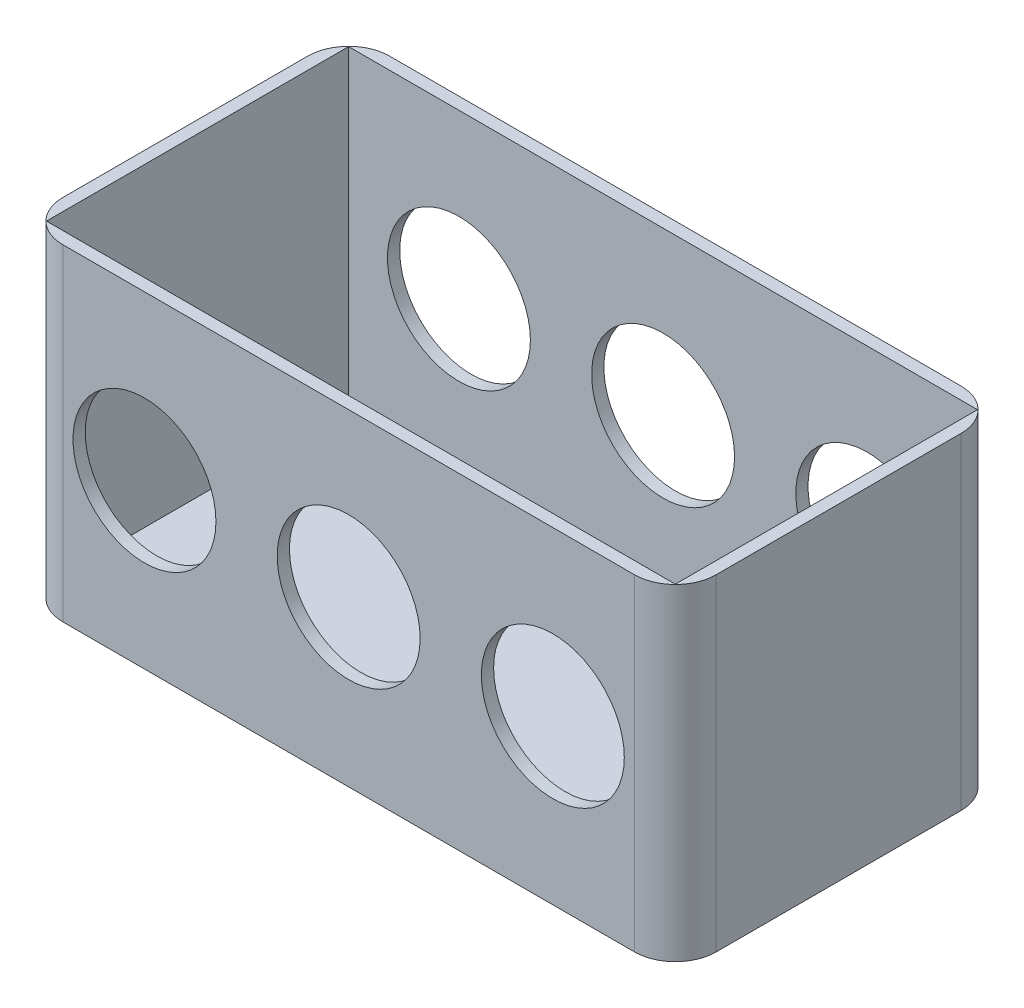
ISO-10303-21;
HEADER;
FILE_DESCRIPTION(('STEP AP214'),'2;1');
FILE_NAME('part.step','',(''),(''),'','','');
FILE_SCHEMA(('AUTOMOTIVE_DESIGN { 1 0 10303 214 1 1 1 1 }'));
ENDSEC;
DATA;
#1=APPLICATION_CONTEXT('core data for automotive mechanical design processes');
#2=APPLICATION_PROTOCOL_DEFINITION('international standard','automotive_design',2000,#1);
#3=PRODUCT_CONTEXT('',#1,'mechanical');
#4=PRODUCT('Part','Part','',(#3));
#5=PRODUCT_RELATED_PRODUCT_CATEGORY('part','',(#4));
#6=PRODUCT_DEFINITION_FORMATION('','',#4);
#7=PRODUCT_DEFINITION_CONTEXT('part definition',#1,'design');
#8=PRODUCT_DEFINITION('design','',#6,#7);
#9=PRODUCT_DEFINITION_SHAPE('','',#8);
#10=(LENGTH_UNIT() NAMED_UNIT(*) SI_UNIT(.MILLI.,.METRE.));
#11=(NAMED_UNIT(*) PLANE_ANGLE_UNIT() SI_UNIT($,.RADIAN.));
#12=(NAMED_UNIT(*) SI_UNIT($,.STERADIAN.) SOLID_ANGLE_UNIT());
#13=UNCERTAINTY_MEASURE_WITH_UNIT(LENGTH_MEASURE(1.E-05),#10,'distance_accuracy_value','');
#14=(GEOMETRIC_REPRESENTATION_CONTEXT(3) GLOBAL_UNCERTAINTY_ASSIGNED_CONTEXT((#13)) GLOBAL_UNIT_ASSIGNED_CONTEXT((#10,
#11,#12)) REPRESENTATION_CONTEXT('',''));
#15=CARTESIAN_POINT('',(0.,0.,0.));
#16=DIRECTION('',(0.,0.,1.));
#17=DIRECTION('',(1.,0.,0.));
#18=AXIS2_PLACEMENT_3D('',#15,#16,#17);
#19=CARTESIAN_POINT('',(80.,80.,-40.));
#20=DIRECTION('',(-1.,0.,0.));
#21=DIRECTION('',(0.,0.,1.));
#22=AXIS2_PLACEMENT_3D('',#19,#20,#21);
#23=PLANE('',#22);
#24=DIRECTION('',(0.,0.,-1.));
#25=VECTOR('',#24,1.);
#26=CARTESIAN_POINT('',(80.,80.,-40.));
#27=LINE('',#26,#25);
#28=CARTESIAN_POINT('',(80.,80.,30.));
#29=VERTEX_POINT('',#28);
#30=CARTESIAN_POINT('',(80.,80.,-30.));
#31=VERTEX_POINT('',#30);
#32=EDGE_CURVE('E176',#29,#31,#27,.T.);
#33=ORIENTED_EDGE('',*,*,#32,.F.);
#34=DIRECTION('',(0.,-1.,0.));
#35=VECTOR('',#34,1.);
#36=CARTESIAN_POINT('',(80.,80.,30.));
#37=LINE('',#36,#35);
#38=CARTESIAN_POINT('',(80.,0.,30.));
#39=VERTEX_POINT('',#38);
#40=EDGE_CURVE('E261',#29,#39,#37,.T.);
#41=ORIENTED_EDGE('',*,*,#40,.T.);
#42=DIRECTION('',(0.,0.,-1.));
#43=VECTOR('',#42,1.);
#44=CARTESIAN_POINT('',(80.,0.,-40.));
#45=LINE('',#44,#43);
#46=CARTESIAN_POINT('',(80.,0.,-30.));
#47=VERTEX_POINT('',#46);
#48=EDGE_CURVE('E192',#39,#47,#45,.T.);
#49=ORIENTED_EDGE('',*,*,#48,.T.);
#50=DIRECTION('',(0.,-1.,0.));
#51=VECTOR('',#50,1.);
#52=CARTESIAN_POINT('',(80.,80.,-30.));
#53=LINE('',#52,#51);
#54=EDGE_CURVE('E258',#47,#31,#53,.F.);
#55=ORIENTED_EDGE('',*,*,#54,.T.);
#56=EDGE_LOOP('',(#33,#41,#49,#55));
#57=FACE_BOUND('',#56,.T.);
#58=ADVANCED_FACE('F39',(#57),#23,.F.);
#59=CARTESIAN_POINT('',(-80.,80.,-40.));
#60=DIRECTION('',(0.,0.,1.));
#61=DIRECTION('',(1.,0.,0.));
#62=AXIS2_PLACEMENT_3D('',#59,#60,#61);
#63=PLANE('',#62);
#64=CARTESIAN_POINT('',(-50.,40.,-40.));
#65=DIRECTION('',(0.,0.,1.));
#66=DIRECTION('',(1.,0.,0.));
#67=AXIS2_PLACEMENT_3D('',#64,#65,#66);
#68=CIRCLE('',#67,17.5);
#69=CARTESIAN_POINT('',(-32.5,40.,-40.));
#70=VERTEX_POINT('',#69);
#71=EDGE_CURVE('E211',#70,#70,#68,.T.);
#72=ORIENTED_EDGE('',*,*,#71,.T.);
#73=EDGE_LOOP('',(#72));
#74=FACE_BOUND('',#73,.T.);
#75=CARTESIAN_POINT('',(0.,40.2550575623075,-40.));
#76=DIRECTION('',(0.,0.,1.));
#77=DIRECTION('',(1.,0.,0.));
#78=AXIS2_PLACEMENT_3D('',#75,#76,#77);
#79=CIRCLE('',#78,17.5);
#80=CARTESIAN_POINT('',(17.5,40.2550575623075,-40.));
#81=VERTEX_POINT('',#80);
#82=EDGE_CURVE('E296',#81,#81,#79,.T.);
#83=ORIENTED_EDGE('',*,*,#82,.T.);
#84=EDGE_LOOP('',(#83));
#85=FACE_BOUND('',#84,.T.);
#86=CARTESIAN_POINT('',(50.,40.,-40.));
#87=DIRECTION('',(0.,0.,1.));
#88=DIRECTION('',(1.,0.,0.));
#89=AXIS2_PLACEMENT_3D('',#86,#87,#88);
#90=CIRCLE('',#89,17.5);
#91=CARTESIAN_POINT('',(67.5,40.,-40.));
#92=VERTEX_POINT('',#91);
#93=EDGE_CURVE('E288',#92,#92,#90,.T.);
#94=ORIENTED_EDGE('',*,*,#93,.T.);
#95=EDGE_LOOP('',(#94));
#96=FACE_BOUND('',#95,.T.);
#97=DIRECTION('',(-1.,0.,0.));
#98=VECTOR('',#97,1.);
#99=CARTESIAN_POINT('',(-80.,80.,-40.));
#100=LINE('',#99,#98);
#101=CARTESIAN_POINT('',(70.,80.,-40.));
#102=VERTEX_POINT('',#101);
#103=CARTESIAN_POINT('',(-70.,80.,-40.));
#104=VERTEX_POINT('',#103);
#105=EDGE_CURVE('E179',#102,#104,#100,.T.);
#106=ORIENTED_EDGE('',*,*,#105,.F.);
#107=DIRECTION('',(0.,-1.,0.));
#108=VECTOR('',#107,1.);
#109=CARTESIAN_POINT('',(70.,80.,-40.));
#110=LINE('',#109,#108);
#111=CARTESIAN_POINT('',(70.,0.,-40.));
#112=VERTEX_POINT('',#111);
#113=EDGE_CURVE('E11',#102,#112,#110,.T.);
#114=ORIENTED_EDGE('',*,*,#113,.T.);
#115=DIRECTION('',(-1.,0.,0.));
#116=VECTOR('',#115,1.);
#117=CARTESIAN_POINT('',(-80.,0.,-40.));
#118=LINE('',#117,#116);
#119=CARTESIAN_POINT('',(-70.,0.,-40.));
#120=VERTEX_POINT('',#119);
#121=EDGE_CURVE('E196',#112,#120,#118,.T.);
#122=ORIENTED_EDGE('',*,*,#121,.T.);
#123=DIRECTION('',(0.,-1.,0.));
#124=VECTOR('',#123,1.);
#125=CARTESIAN_POINT('',(-70.,80.,-40.));
#126=LINE('',#125,#124);
#127=EDGE_CURVE('E48',#120,#104,#126,.F.);
#128=ORIENTED_EDGE('',*,*,#127,.T.);
#129=EDGE_LOOP('',(#106,#114,#122,#128));
#130=FACE_BOUND('',#129,.T.);
#131=ADVANCED_FACE('F308',(#74,#85,#96,#130),#63,.F.);
#132=CARTESIAN_POINT('',(-80.,80.,-40.));
#133=DIRECTION('',(1.,0.,0.));
#134=DIRECTION('',(0.,0.,-1.));
#135=AXIS2_PLACEMENT_3D('',#132,#133,#134);
#136=PLANE('',#135);
#137=DIRECTION('',(0.,0.,1.));
#138=VECTOR('',#137,1.);
#139=CARTESIAN_POINT('',(-80.,0.,-40.));
#140=LINE('',#139,#138);
#141=CARTESIAN_POINT('',(-80.,0.,-30.));
#142=VERTEX_POINT('',#141);
#143=CARTESIAN_POINT('',(-80.,0.,30.));
#144=VERTEX_POINT('',#143);
#145=EDGE_CURVE('E199',#142,#144,#140,.T.);
#146=ORIENTED_EDGE('',*,*,#145,.T.);
#147=DIRECTION('',(0.,-1.,0.));
#148=VECTOR('',#147,1.);
#149=CARTESIAN_POINT('',(-80.,80.,30.));
#150=LINE('',#149,#148);
#151=CARTESIAN_POINT('',(-80.,80.,30.));
#152=VERTEX_POINT('',#151);
#153=EDGE_CURVE('E244',#144,#152,#150,.F.);
#154=ORIENTED_EDGE('',*,*,#153,.T.);
#155=DIRECTION('',(0.,0.,1.));
#156=VECTOR('',#155,1.);
#157=CARTESIAN_POINT('',(-80.,80.,-40.));
#158=LINE('',#157,#156);
#159=CARTESIAN_POINT('',(-80.,80.,-30.));
#160=VERTEX_POINT('',#159);
#161=EDGE_CURVE('E183',#160,#152,#158,.T.);
#162=ORIENTED_EDGE('',*,*,#161,.F.);
#163=DIRECTION('',(0.,-1.,0.));
#164=VECTOR('',#163,1.);
#165=CARTESIAN_POINT('',(-80.,80.,-30.));
#166=LINE('',#165,#164);
#167=EDGE_CURVE('E240',#160,#142,#166,.T.);
#168=ORIENTED_EDGE('',*,*,#167,.T.);
#169=EDGE_LOOP('',(#146,#154,#162,#168));
#170=FACE_BOUND('',#169,.T.);
#171=ADVANCED_FACE('F337',(#170),#136,.F.);
#172=CARTESIAN_POINT('',(-80.,80.,40.));
#173=DIRECTION('',(0.,0.,-1.));
#174=DIRECTION('',(-1.,0.,0.));
#175=AXIS2_PLACEMENT_3D('',#172,#173,#174);
#176=PLANE('',#175);
#177=CARTESIAN_POINT('',(-50.,40.,40.));
#178=DIRECTION('',(0.,0.,1.));
#179=DIRECTION('',(1.,0.,0.));
#180=AXIS2_PLACEMENT_3D('',#177,#178,#179);
#181=CIRCLE('',#180,17.5);
#182=CARTESIAN_POINT('',(-32.5,40.,40.));
#183=VERTEX_POINT('',#182);
#184=EDGE_CURVE('E300',#183,#183,#181,.T.);
#185=ORIENTED_EDGE('',*,*,#184,.F.);
#186=EDGE_LOOP('',(#185));
#187=FACE_BOUND('',#186,.T.);
#188=CARTESIAN_POINT('',(0.,40.2550575623075,40.));
#189=DIRECTION('',(0.,0.,1.));
#190=DIRECTION('',(1.,0.,0.));
#191=AXIS2_PLACEMENT_3D('',#188,#189,#190);
#192=CIRCLE('',#191,17.5);
#193=CARTESIAN_POINT('',(17.5,40.2550575623075,40.));
#194=VERTEX_POINT('',#193);
#195=EDGE_CURVE('E292',#194,#194,#192,.T.);
#196=ORIENTED_EDGE('',*,*,#195,.F.);
#197=EDGE_LOOP('',(#196));
#198=FACE_BOUND('',#197,.T.);
#199=CARTESIAN_POINT('',(50.,40.,40.));
#200=DIRECTION('',(0.,0.,1.));
#201=DIRECTION('',(1.,0.,0.));
#202=AXIS2_PLACEMENT_3D('',#199,#200,#201);
#203=CIRCLE('',#202,17.5);
#204=CARTESIAN_POINT('',(67.5,40.,40.));
#205=VERTEX_POINT('',#204);
#206=EDGE_CURVE('E284',#205,#205,#203,.T.);
#207=ORIENTED_EDGE('',*,*,#206,.F.);
#208=EDGE_LOOP('',(#207));
#209=FACE_BOUND('',#208,.T.);
#210=DIRECTION('',(1.,0.,0.));
#211=VECTOR('',#210,1.);
#212=CARTESIAN_POINT('',(-80.,80.,40.));
#213=LINE('',#212,#211);
#214=CARTESIAN_POINT('',(-70.,80.,40.));
#215=VERTEX_POINT('',#214);
#216=CARTESIAN_POINT('',(70.,80.,40.));
#217=VERTEX_POINT('',#216);
#218=EDGE_CURVE('E187',#215,#217,#213,.T.);
#219=ORIENTED_EDGE('',*,*,#218,.F.);
#220=DIRECTION('',(0.,-1.,0.));
#221=VECTOR('',#220,1.);
#222=CARTESIAN_POINT('',(-70.,80.,40.));
#223=LINE('',#222,#221);
#224=CARTESIAN_POINT('',(-70.,0.,40.));
#225=VERTEX_POINT('',#224);
#226=EDGE_CURVE('E224',#215,#225,#223,.T.);
#227=ORIENTED_EDGE('',*,*,#226,.T.);
#228=DIRECTION('',(1.,0.,0.));
#229=VECTOR('',#228,1.);
#230=CARTESIAN_POINT('',(-80.,0.,40.));
#231=LINE('',#230,#229);
#232=CARTESIAN_POINT('',(70.,0.,40.));
#233=VERTEX_POINT('',#232);
#234=EDGE_CURVE('E180',#225,#233,#231,.T.);
#235=ORIENTED_EDGE('',*,*,#234,.T.);
#236=DIRECTION('',(0.,-1.,0.));
#237=VECTOR('',#236,1.);
#238=CARTESIAN_POINT('',(70.,80.,40.));
#239=LINE('',#238,#237);
#240=EDGE_CURVE('E191',#233,#217,#239,.F.);
#241=ORIENTED_EDGE('',*,*,#240,.T.);
#242=EDGE_LOOP('',(#219,#227,#235,#241));
#243=FACE_BOUND('',#242,.T.);
#244=ADVANCED_FACE('F369',(#187,#198,#209,#243),#176,.F.);
#245=CARTESIAN_POINT('',(0.,80.,0.));
#246=DIRECTION('',(0.,1.,0.));
#247=DIRECTION('',(0.,0.,1.));
#248=AXIS2_PLACEMENT_3D('',#245,#246,#247);
#249=PLANE('',#248);
#250=DIRECTION('',(0.,0.,-1.));
#251=VECTOR('',#250,1.);
#252=CARTESIAN_POINT('',(77.,80.,-40.));
#253=LINE('',#252,#251);
#254=CARTESIAN_POINT('',(77.,80.,37.));
#255=VERTEX_POINT('',#254);
#256=CARTESIAN_POINT('',(77.,80.,-37.));
#257=VERTEX_POINT('',#256);
#258=EDGE_CURVE('E160',#255,#257,#253,.T.);
#259=ORIENTED_EDGE('',*,*,#258,.F.);
#260=DIRECTION('',(1.,0.,0.));
#261=VECTOR('',#260,1.);
#262=CARTESIAN_POINT('',(-80.,80.,37.));
#263=LINE('',#262,#261);
#264=CARTESIAN_POINT('',(-77.,80.,37.));
#265=VERTEX_POINT('',#264);
#266=EDGE_CURVE('E173',#265,#255,#263,.T.);
#267=ORIENTED_EDGE('',*,*,#266,.F.);
#268=DIRECTION('',(0.,0.,1.));
#269=VECTOR('',#268,1.);
#270=CARTESIAN_POINT('',(-77.,80.,-40.));
#271=LINE('',#270,#269);
#272=CARTESIAN_POINT('',(-77.,80.,-37.));
#273=VERTEX_POINT('',#272);
#274=EDGE_CURVE('E170',#273,#265,#271,.T.);
#275=ORIENTED_EDGE('',*,*,#274,.F.);
#276=DIRECTION('',(-1.,0.,0.));
#277=VECTOR('',#276,1.);
#278=CARTESIAN_POINT('',(-80.,80.,-37.));
#279=LINE('',#278,#277);
#280=EDGE_CURVE('E146',#257,#273,#279,.T.);
#281=ORIENTED_EDGE('',*,*,#280,.F.);
#282=EDGE_LOOP('',(#259,#267,#275,#281));
#283=FACE_BOUND('',#282,.T.);
#284=ORIENTED_EDGE('',*,*,#161,.T.);
#285=CARTESIAN_POINT('',(-70.,80.,30.));
#286=DIRECTION('',(0.,1.,0.));
#287=DIRECTION('',(0.,0.,1.));
#288=AXIS2_PLACEMENT_3D('',#285,#286,#287);
#289=CIRCLE('',#288,10.);
#290=EDGE_CURVE('E255',#152,#215,#289,.T.);
#291=ORIENTED_EDGE('',*,*,#290,.T.);
#292=ORIENTED_EDGE('',*,*,#218,.T.);
#293=CARTESIAN_POINT('',(70.,80.,30.));
#294=DIRECTION('',(0.,1.,0.));
#295=DIRECTION('',(0.,0.,1.));
#296=AXIS2_PLACEMENT_3D('',#293,#294,#295);
#297=CIRCLE('',#296,10.);
#298=EDGE_CURVE('E252',#217,#29,#297,.T.);
#299=ORIENTED_EDGE('',*,*,#298,.T.);
#300=ORIENTED_EDGE('',*,*,#32,.T.);
#301=CARTESIAN_POINT('',(70.,80.,-30.));
#302=DIRECTION('',(0.,1.,0.));
#303=DIRECTION('',(0.,0.,1.));
#304=AXIS2_PLACEMENT_3D('',#301,#302,#303);
#305=CIRCLE('',#304,10.);
#306=EDGE_CURVE('E61',#31,#102,#305,.T.);
#307=ORIENTED_EDGE('',*,*,#306,.T.);
#308=ORIENTED_EDGE('',*,*,#105,.T.);
#309=CARTESIAN_POINT('',(-70.,80.,-30.));
#310=DIRECTION('',(0.,1.,0.));
#311=DIRECTION('',(0.,0.,1.));
#312=AXIS2_PLACEMENT_3D('',#309,#310,#311);
#313=CIRCLE('',#312,10.);
#314=EDGE_CURVE('E247',#104,#160,#313,.T.);
#315=ORIENTED_EDGE('',*,*,#314,.T.);
#316=EDGE_LOOP('',(#284,#291,#292,#299,#300,#307,#308,#315));
#317=FACE_BOUND('',#316,.T.);
#318=ADVANCED_FACE('F365',(#283,#317),#249,.T.);
#319=CARTESIAN_POINT('',(0.,0.,0.));
#320=DIRECTION('',(0.,1.,0.));
#321=DIRECTION('',(0.,0.,1.));
#322=AXIS2_PLACEMENT_3D('',#319,#320,#321);
#323=PLANE('',#322);
#324=ORIENTED_EDGE('',*,*,#234,.F.);
#325=CARTESIAN_POINT('',(-70.,0.,30.));
#326=DIRECTION('',(0.,1.,0.));
#327=DIRECTION('',(0.,0.,1.));
#328=AXIS2_PLACEMENT_3D('',#325,#326,#327);
#329=CIRCLE('',#328,10.);
#330=EDGE_CURVE('E237',#225,#144,#329,.F.);
#331=ORIENTED_EDGE('',*,*,#330,.T.);
#332=ORIENTED_EDGE('',*,*,#145,.F.);
#333=CARTESIAN_POINT('',(-70.,0.,-30.));
#334=DIRECTION('',(0.,1.,0.));
#335=DIRECTION('',(0.,0.,1.));
#336=AXIS2_PLACEMENT_3D('',#333,#334,#335);
#337=CIRCLE('',#336,10.);
#338=EDGE_CURVE('E228',#142,#120,#337,.F.);
#339=ORIENTED_EDGE('',*,*,#338,.T.);
#340=ORIENTED_EDGE('',*,*,#121,.F.);
#341=CARTESIAN_POINT('',(70.,0.,-30.));
#342=DIRECTION('',(0.,1.,0.));
#343=DIRECTION('',(0.,0.,1.));
#344=AXIS2_PLACEMENT_3D('',#341,#342,#343);
#345=CIRCLE('',#344,10.);
#346=EDGE_CURVE('E231',#112,#47,#345,.F.);
#347=ORIENTED_EDGE('',*,*,#346,.T.);
#348=ORIENTED_EDGE('',*,*,#48,.F.);
#349=CARTESIAN_POINT('',(70.,0.,30.));
#350=DIRECTION('',(0.,1.,0.));
#351=DIRECTION('',(0.,0.,1.));
#352=AXIS2_PLACEMENT_3D('',#349,#350,#351);
#353=CIRCLE('',#352,10.);
#354=EDGE_CURVE('E234',#39,#233,#353,.F.);
#355=ORIENTED_EDGE('',*,*,#354,.T.);
#356=EDGE_LOOP('',(#324,#331,#332,#339,#340,#347,#348,#355));
#357=FACE_BOUND('',#356,.T.);
#358=ADVANCED_FACE('F356',(#357),#323,.F.);
#359=CARTESIAN_POINT('',(77.,80.,-40.));
#360=DIRECTION('',(-1.,0.,0.));
#361=DIRECTION('',(0.,0.,1.));
#362=AXIS2_PLACEMENT_3D('',#359,#360,#361);
#363=PLANE('',#362);
#364=DIRECTION('',(0.,0.,-1.));
#365=VECTOR('',#364,1.);
#366=CARTESIAN_POINT('',(77.,3.,-40.));
#367=LINE('',#366,#365);
#368=CARTESIAN_POINT('',(77.,3.,37.));
#369=VERTEX_POINT('',#368);
#370=CARTESIAN_POINT('',(77.,3.,-37.));
#371=VERTEX_POINT('',#370);
#372=EDGE_CURVE('E136',#369,#371,#367,.T.);
#373=ORIENTED_EDGE('',*,*,#372,.F.);
#374=DIRECTION('',(0.,-1.,0.));
#375=VECTOR('',#374,1.);
#376=CARTESIAN_POINT('',(77.,80.,37.));
#377=LINE('',#376,#375);
#378=EDGE_CURVE('E164',#255,#369,#377,.T.);
#379=ORIENTED_EDGE('',*,*,#378,.F.);
#380=ORIENTED_EDGE('',*,*,#258,.T.);
#381=DIRECTION('',(0.,-1.,0.));
#382=VECTOR('',#381,1.);
#383=CARTESIAN_POINT('',(77.,80.,-37.));
#384=LINE('',#383,#382);
#385=EDGE_CURVE('E151',#257,#371,#384,.T.);
#386=ORIENTED_EDGE('',*,*,#385,.T.);
#387=EDGE_LOOP('',(#373,#379,#380,#386));
#388=FACE_BOUND('',#387,.T.);
#389=ADVANCED_FACE('F386',(#388),#363,.T.);
#390=CARTESIAN_POINT('',(-80.,80.,-37.));
#391=DIRECTION('',(0.,0.,1.));
#392=DIRECTION('',(1.,0.,0.));
#393=AXIS2_PLACEMENT_3D('',#390,#391,#392);
#394=PLANE('',#393);
#395=CARTESIAN_POINT('',(-50.,40.,-37.));
#396=DIRECTION('',(0.,0.,1.));
#397=DIRECTION('',(1.,0.,0.));
#398=AXIS2_PLACEMENT_3D('',#395,#396,#397);
#399=CIRCLE('',#398,17.5);
#400=CARTESIAN_POINT('',(-32.5,40.,-37.));
#401=VERTEX_POINT('',#400);
#402=EDGE_CURVE('E221',#401,#401,#399,.T.);
#403=ORIENTED_EDGE('',*,*,#402,.F.);
#404=EDGE_LOOP('',(#403));
#405=FACE_BOUND('',#404,.T.);
#406=CARTESIAN_POINT('',(0.,40.2550575623075,-37.));
#407=DIRECTION('',(0.,0.,1.));
#408=DIRECTION('',(1.,0.,0.));
#409=AXIS2_PLACEMENT_3D('',#406,#407,#408);
#410=CIRCLE('',#409,17.5);
#411=CARTESIAN_POINT('',(17.5,40.2550575623075,-37.));
#412=VERTEX_POINT('',#411);
#413=EDGE_CURVE('E216',#412,#412,#410,.T.);
#414=ORIENTED_EDGE('',*,*,#413,.F.);
#415=EDGE_LOOP('',(#414));
#416=FACE_BOUND('',#415,.T.);
#417=CARTESIAN_POINT('',(50.,40.,-37.));
#418=DIRECTION('',(0.,0.,1.));
#419=DIRECTION('',(1.,0.,0.));
#420=AXIS2_PLACEMENT_3D('',#417,#418,#419);
#421=CIRCLE('',#420,17.5);
#422=CARTESIAN_POINT('',(67.5,40.,-37.));
#423=VERTEX_POINT('',#422);
#424=EDGE_CURVE('E210',#423,#423,#421,.T.);
#425=ORIENTED_EDGE('',*,*,#424,.F.);
#426=EDGE_LOOP('',(#425));
#427=FACE_BOUND('',#426,.T.);
#428=DIRECTION('',(-1.,0.,0.));
#429=VECTOR('',#428,1.);
#430=CARTESIAN_POINT('',(-80.,3.,-37.));
#431=LINE('',#430,#429);
#432=CARTESIAN_POINT('',(-77.,3.,-37.));
#433=VERTEX_POINT('',#432);
#434=EDGE_CURVE('E129',#371,#433,#431,.T.);
#435=ORIENTED_EDGE('',*,*,#434,.F.);
#436=ORIENTED_EDGE('',*,*,#385,.F.);
#437=ORIENTED_EDGE('',*,*,#280,.T.);
#438=DIRECTION('',(0.,-1.,0.));
#439=VECTOR('',#438,1.);
#440=CARTESIAN_POINT('',(-77.,80.,-37.));
#441=LINE('',#440,#439);
#442=EDGE_CURVE('E143',#273,#433,#441,.T.);
#443=ORIENTED_EDGE('',*,*,#442,.T.);
#444=EDGE_LOOP('',(#435,#436,#437,#443));
#445=FACE_BOUND('',#444,.T.);
#446=ADVANCED_FACE('F144',(#405,#416,#427,#445),#394,.T.);
#447=CARTESIAN_POINT('',(-77.,80.,-40.));
#448=DIRECTION('',(1.,0.,0.));
#449=DIRECTION('',(0.,0.,-1.));
#450=AXIS2_PLACEMENT_3D('',#447,#448,#449);
#451=PLANE('',#450);
#452=DIRECTION('',(0.,0.,1.));
#453=VECTOR('',#452,1.);
#454=CARTESIAN_POINT('',(-77.,3.,-40.));
#455=LINE('',#454,#453);
#456=CARTESIAN_POINT('',(-77.,3.,37.));
#457=VERTEX_POINT('',#456);
#458=EDGE_CURVE('E133',#433,#457,#455,.T.);
#459=ORIENTED_EDGE('',*,*,#458,.F.);
#460=ORIENTED_EDGE('',*,*,#442,.F.);
#461=ORIENTED_EDGE('',*,*,#274,.T.);
#462=DIRECTION('',(0.,-1.,0.));
#463=VECTOR('',#462,1.);
#464=CARTESIAN_POINT('',(-77.,80.,37.));
#465=LINE('',#464,#463);
#466=EDGE_CURVE('E152',#265,#457,#465,.T.);
#467=ORIENTED_EDGE('',*,*,#466,.T.);
#468=EDGE_LOOP('',(#459,#460,#461,#467));
#469=FACE_BOUND('',#468,.T.);
#470=ADVANCED_FACE('F154',(#469),#451,.T.);
#471=CARTESIAN_POINT('',(-80.,80.,37.));
#472=DIRECTION('',(0.,0.,-1.));
#473=DIRECTION('',(-1.,0.,0.));
#474=AXIS2_PLACEMENT_3D('',#471,#472,#473);
#475=PLANE('',#474);
#476=CARTESIAN_POINT('',(-50.,40.,37.));
#477=DIRECTION('',(0.,0.,-1.));
#478=DIRECTION('',(-1.,0.,0.));
#479=AXIS2_PLACEMENT_3D('',#476,#477,#478);
#480=CIRCLE('',#479,17.5);
#481=CARTESIAN_POINT('',(-67.5,40.,37.));
#482=VERTEX_POINT('',#481);
#483=EDGE_CURVE('E217',#482,#482,#480,.T.);
#484=ORIENTED_EDGE('',*,*,#483,.F.);
#485=EDGE_LOOP('',(#484));
#486=FACE_BOUND('',#485,.T.);
#487=CARTESIAN_POINT('',(0.,40.2550575623075,37.));
#488=DIRECTION('',(0.,0.,-1.));
#489=DIRECTION('',(-1.,0.,0.));
#490=AXIS2_PLACEMENT_3D('',#487,#488,#489);
#491=CIRCLE('',#490,17.5);
#492=CARTESIAN_POINT('',(-17.5,40.2550575623075,37.));
#493=VERTEX_POINT('',#492);
#494=EDGE_CURVE('E212',#493,#493,#491,.T.);
#495=ORIENTED_EDGE('',*,*,#494,.F.);
#496=EDGE_LOOP('',(#495));
#497=FACE_BOUND('',#496,.T.);
#498=CARTESIAN_POINT('',(50.,40.,37.));
#499=DIRECTION('',(0.,0.,-1.));
#500=DIRECTION('',(-1.,0.,0.));
#501=AXIS2_PLACEMENT_3D('',#498,#499,#500);
#502=CIRCLE('',#501,17.5);
#503=CARTESIAN_POINT('',(32.5,40.,37.));
#504=VERTEX_POINT('',#503);
#505=EDGE_CURVE('E206',#504,#504,#502,.T.);
#506=ORIENTED_EDGE('',*,*,#505,.F.);
#507=EDGE_LOOP('',(#506));
#508=FACE_BOUND('',#507,.T.);
#509=DIRECTION('',(1.,0.,0.));
#510=VECTOR('',#509,1.);
#511=CARTESIAN_POINT('',(-80.,3.,37.));
#512=LINE('',#511,#510);
#513=EDGE_CURVE('E157',#457,#369,#512,.T.);
#514=ORIENTED_EDGE('',*,*,#513,.F.);
#515=ORIENTED_EDGE('',*,*,#466,.F.);
#516=ORIENTED_EDGE('',*,*,#266,.T.);
#517=ORIENTED_EDGE('',*,*,#378,.T.);
#518=EDGE_LOOP('',(#514,#515,#516,#517));
#519=FACE_BOUND('',#518,.T.);
#520=ADVANCED_FACE('F391',(#486,#497,#508,#519),#475,.T.);
#521=CARTESIAN_POINT('',(0.,3.,0.));
#522=DIRECTION('',(0.,1.,0.));
#523=DIRECTION('',(0.,0.,1.));
#524=AXIS2_PLACEMENT_3D('',#521,#522,#523);
#525=PLANE('',#524);
#526=ORIENTED_EDGE('',*,*,#372,.T.);
#527=ORIENTED_EDGE('',*,*,#434,.T.);
#528=ORIENTED_EDGE('',*,*,#458,.T.);
#529=ORIENTED_EDGE('',*,*,#513,.T.);
#530=EDGE_LOOP('',(#526,#527,#528,#529));
#531=FACE_BOUND('',#530,.T.);
#532=ADVANCED_FACE('F131',(#531),#525,.T.);
#533=CARTESIAN_POINT('',(50.,40.,-40.));
#534=DIRECTION('',(0.,0.,1.));
#535=DIRECTION('',(1.,0.,0.));
#536=AXIS2_PLACEMENT_3D('',#533,#534,#535);
#537=CYLINDRICAL_SURFACE('',#536,17.5);
#538=ORIENTED_EDGE('',*,*,#505,.T.);
#539=EDGE_LOOP('',(#538));
#540=FACE_BOUND('',#539,.T.);
#541=ORIENTED_EDGE('',*,*,#206,.T.);
#542=EDGE_LOOP('',(#541));
#543=FACE_BOUND('',#542,.T.);
#544=ADVANCED_FACE('F390',(#540,#543),#537,.F.);
#545=CARTESIAN_POINT('',(0.,40.2550575623075,-40.));
#546=DIRECTION('',(0.,0.,1.));
#547=DIRECTION('',(1.,0.,0.));
#548=AXIS2_PLACEMENT_3D('',#545,#546,#547);
#549=CYLINDRICAL_SURFACE('',#548,17.5);
#550=ORIENTED_EDGE('',*,*,#494,.T.);
#551=EDGE_LOOP('',(#550));
#552=FACE_BOUND('',#551,.T.);
#553=ORIENTED_EDGE('',*,*,#195,.T.);
#554=EDGE_LOOP('',(#553));
#555=FACE_BOUND('',#554,.T.);
#556=ADVANCED_FACE('F328',(#552,#555),#549,.F.);
#557=CARTESIAN_POINT('',(-50.,40.,-40.));
#558=DIRECTION('',(0.,0.,1.));
#559=DIRECTION('',(1.,0.,0.));
#560=AXIS2_PLACEMENT_3D('',#557,#558,#559);
#561=CYLINDRICAL_SURFACE('',#560,17.5);
#562=ORIENTED_EDGE('',*,*,#483,.T.);
#563=EDGE_LOOP('',(#562));
#564=FACE_BOUND('',#563,.T.);
#565=ORIENTED_EDGE('',*,*,#184,.T.);
#566=EDGE_LOOP('',(#565));
#567=FACE_BOUND('',#566,.T.);
#568=ADVANCED_FACE('F317',(#564,#567),#561,.F.);
#569=ORIENTED_EDGE('',*,*,#424,.T.);
#570=EDGE_LOOP('',(#569));
#571=FACE_BOUND('',#570,.T.);
#572=ORIENTED_EDGE('',*,*,#93,.F.);
#573=EDGE_LOOP('',(#572));
#574=FACE_BOUND('',#573,.T.);
#575=ADVANCED_FACE('F325',(#571,#574),#537,.F.);
#576=ORIENTED_EDGE('',*,*,#413,.T.);
#577=EDGE_LOOP('',(#576));
#578=FACE_BOUND('',#577,.T.);
#579=ORIENTED_EDGE('',*,*,#82,.F.);
#580=EDGE_LOOP('',(#579));
#581=FACE_BOUND('',#580,.T.);
#582=ADVANCED_FACE('F314',(#578,#581),#549,.F.);
#583=ORIENTED_EDGE('',*,*,#402,.T.);
#584=EDGE_LOOP('',(#583));
#585=FACE_BOUND('',#584,.T.);
#586=ORIENTED_EDGE('',*,*,#71,.F.);
#587=EDGE_LOOP('',(#586));
#588=FACE_BOUND('',#587,.T.);
#589=ADVANCED_FACE('F311',(#585,#588),#561,.F.);
#590=CARTESIAN_POINT('',(-70.,80.,30.));
#591=DIRECTION('',(0.,-1.,0.));
#592=DIRECTION('',(0.,0.,-1.));
#593=AXIS2_PLACEMENT_3D('',#590,#591,#592);
#594=CYLINDRICAL_SURFACE('',#593,10.);
#595=ORIENTED_EDGE('',*,*,#290,.F.);
#596=ORIENTED_EDGE('',*,*,#153,.F.);
#597=ORIENTED_EDGE('',*,*,#330,.F.);
#598=ORIENTED_EDGE('',*,*,#226,.F.);
#599=EDGE_LOOP('',(#595,#596,#597,#598));
#600=FACE_BOUND('',#599,.T.);
#601=ADVANCED_FACE('F313',(#600),#594,.T.);
#602=CARTESIAN_POINT('',(70.,80.,30.));
#603=DIRECTION('',(0.,-1.,0.));
#604=DIRECTION('',(0.,0.,-1.));
#605=AXIS2_PLACEMENT_3D('',#602,#603,#604);
#606=CYLINDRICAL_SURFACE('',#605,10.);
#607=ORIENTED_EDGE('',*,*,#298,.F.);
#608=ORIENTED_EDGE('',*,*,#240,.F.);
#609=ORIENTED_EDGE('',*,*,#354,.F.);
#610=ORIENTED_EDGE('',*,*,#40,.F.);
#611=EDGE_LOOP('',(#607,#608,#609,#610));
#612=FACE_BOUND('',#611,.T.);
#613=ADVANCED_FACE('F322',(#612),#606,.T.);
#614=CARTESIAN_POINT('',(70.,80.,-30.));
#615=DIRECTION('',(0.,-1.,0.));
#616=DIRECTION('',(0.,0.,-1.));
#617=AXIS2_PLACEMENT_3D('',#614,#615,#616);
#618=CYLINDRICAL_SURFACE('',#617,10.);
#619=ORIENTED_EDGE('',*,*,#306,.F.);
#620=ORIENTED_EDGE('',*,*,#54,.F.);
#621=ORIENTED_EDGE('',*,*,#346,.F.);
#622=ORIENTED_EDGE('',*,*,#113,.F.);
#623=EDGE_LOOP('',(#619,#620,#621,#622));
#624=FACE_BOUND('',#623,.T.);
#625=ADVANCED_FACE('F343',(#624),#618,.T.);
#626=CARTESIAN_POINT('',(-70.,80.,-30.));
#627=DIRECTION('',(0.,-1.,0.));
#628=DIRECTION('',(0.,0.,-1.));
#629=AXIS2_PLACEMENT_3D('',#626,#627,#628);
#630=CYLINDRICAL_SURFACE('',#629,10.);
#631=ORIENTED_EDGE('',*,*,#314,.F.);
#632=ORIENTED_EDGE('',*,*,#127,.F.);
#633=ORIENTED_EDGE('',*,*,#338,.F.);
#634=ORIENTED_EDGE('',*,*,#167,.F.);
#635=EDGE_LOOP('',(#631,#632,#633,#634));
#636=FACE_BOUND('',#635,.T.);
#637=ADVANCED_FACE('F41',(#636),#630,.T.);
#638=CLOSED_SHELL('',(#58,#131,#171,#244,#318,#358,#389,#446,#470,#520,#532,#544,#556,#568,#575,
#582,#589,#601,#613,#625,#637));
#639=MANIFOLD_SOLID_BREP('B2',#638);
#640=ADVANCED_BREP_SHAPE_REPRESENTATION('',(#18,#639),#14);
#641=SHAPE_DEFINITION_REPRESENTATION(#9,#640);
ENDSEC;
END-ISO-10303-21;
